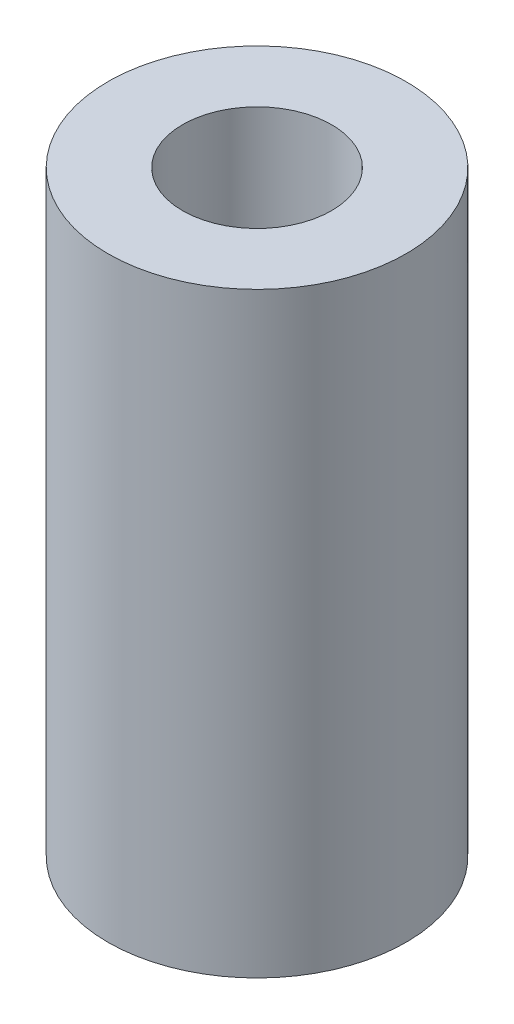
ISO-10303-21;
HEADER;
FILE_DESCRIPTION(('STEP AP214'),'2;1');
FILE_NAME('part.step','',(''),(''),'','','');
FILE_SCHEMA(('AUTOMOTIVE_DESIGN { 1 0 10303 214 1 1 1 1 }'));
ENDSEC;
DATA;
#1=APPLICATION_CONTEXT('core data for automotive mechanical design processes');
#2=APPLICATION_PROTOCOL_DEFINITION('international standard','automotive_design',2000,#1);
#3=PRODUCT_CONTEXT('',#1,'mechanical');
#4=PRODUCT('Part','Part','',(#3));
#5=PRODUCT_RELATED_PRODUCT_CATEGORY('part','',(#4));
#6=PRODUCT_DEFINITION_FORMATION('','',#4);
#7=PRODUCT_DEFINITION_CONTEXT('part definition',#1,'design');
#8=PRODUCT_DEFINITION('design','',#6,#7);
#9=PRODUCT_DEFINITION_SHAPE('','',#8);
#10=(LENGTH_UNIT() NAMED_UNIT(*) SI_UNIT(.MILLI.,.METRE.));
#11=(NAMED_UNIT(*) PLANE_ANGLE_UNIT() SI_UNIT($,.RADIAN.));
#12=(NAMED_UNIT(*) SI_UNIT($,.STERADIAN.) SOLID_ANGLE_UNIT());
#13=UNCERTAINTY_MEASURE_WITH_UNIT(LENGTH_MEASURE(1.E-05),#10,'distance_accuracy_value','');
#14=(GEOMETRIC_REPRESENTATION_CONTEXT(3) GLOBAL_UNCERTAINTY_ASSIGNED_CONTEXT((#13)) GLOBAL_UNIT_ASSIGNED_CONTEXT((#10,
#11,#12)) REPRESENTATION_CONTEXT('',''));
#15=CARTESIAN_POINT('',(0.,0.,0.));
#16=DIRECTION('',(0.,0.,1.));
#17=DIRECTION('',(1.,0.,0.));
#18=AXIS2_PLACEMENT_3D('',#15,#16,#17);
#19=CARTESIAN_POINT('',(0.,5.08,0.));
#20=DIRECTION('',(0.,1.,0.));
#21=DIRECTION('',(0.,0.,1.));
#22=AXIS2_PLACEMENT_3D('',#19,#20,#21);
#23=PLANE('',#22);
#24=CARTESIAN_POINT('',(0.,5.08,0.));
#25=DIRECTION('',(0.,1.,0.));
#26=DIRECTION('',(0.,0.,1.));
#27=AXIS2_PLACEMENT_3D('',#24,#25,#26);
#28=CIRCLE('',#27,2.54);
#29=CARTESIAN_POINT('',(0.,5.08,2.54));
#30=VERTEX_POINT('',#29);
#31=EDGE_CURVE('E10',#30,#30,#28,.T.);
#32=ORIENTED_EDGE('',*,*,#31,.T.);
#33=EDGE_LOOP('',(#32));
#34=FACE_BOUND('',#33,.T.);
#35=CARTESIAN_POINT('',(0.,5.08,0.));
#36=DIRECTION('',(0.,1.,0.));
#37=DIRECTION('',(0.,0.,1.));
#38=AXIS2_PLACEMENT_3D('',#35,#36,#37);
#39=CIRCLE('',#38,1.27);
#40=CARTESIAN_POINT('',(0.,5.08,1.27));
#41=VERTEX_POINT('',#40);
#42=EDGE_CURVE('E43',#41,#41,#39,.T.);
#43=ORIENTED_EDGE('',*,*,#42,.F.);
#44=EDGE_LOOP('',(#43));
#45=FACE_BOUND('',#44,.T.);
#46=ADVANCED_FACE('F32',(#34,#45),#23,.T.);
#47=CARTESIAN_POINT('',(0.,-5.08,0.));
#48=DIRECTION('',(0.,1.,0.));
#49=DIRECTION('',(0.,0.,1.));
#50=AXIS2_PLACEMENT_3D('',#47,#48,#49);
#51=PLANE('',#50);
#52=CARTESIAN_POINT('',(0.,-5.08,0.));
#53=DIRECTION('',(0.,1.,0.));
#54=DIRECTION('',(0.,0.,1.));
#55=AXIS2_PLACEMENT_3D('',#52,#53,#54);
#56=CIRCLE('',#55,2.54);
#57=CARTESIAN_POINT('',(0.,-5.08,2.54));
#58=VERTEX_POINT('',#57);
#59=EDGE_CURVE('E36',#58,#58,#56,.T.);
#60=ORIENTED_EDGE('',*,*,#59,.F.);
#61=EDGE_LOOP('',(#60));
#62=FACE_BOUND('',#61,.T.);
#63=CARTESIAN_POINT('',(0.,-5.08,0.));
#64=DIRECTION('',(0.,1.,0.));
#65=DIRECTION('',(0.,0.,1.));
#66=AXIS2_PLACEMENT_3D('',#63,#64,#65);
#67=CIRCLE('',#66,1.27);
#68=CARTESIAN_POINT('',(0.,-5.08,1.27));
#69=VERTEX_POINT('',#68);
#70=EDGE_CURVE('E45',#69,#69,#67,.T.);
#71=ORIENTED_EDGE('',*,*,#70,.T.);
#72=EDGE_LOOP('',(#71));
#73=FACE_BOUND('',#72,.T.);
#74=ADVANCED_FACE('F55',(#62,#73),#51,.F.);
#75=CARTESIAN_POINT('',(0.,5.08,0.));
#76=DIRECTION('',(0.,-1.,0.));
#77=DIRECTION('',(0.,0.,-1.));
#78=AXIS2_PLACEMENT_3D('',#75,#76,#77);
#79=CYLINDRICAL_SURFACE('',#78,2.54);
#80=ORIENTED_EDGE('',*,*,#31,.F.);
#81=EDGE_LOOP('',(#80));
#82=FACE_BOUND('',#81,.T.);
#83=ORIENTED_EDGE('',*,*,#59,.T.);
#84=EDGE_LOOP('',(#83));
#85=FACE_BOUND('',#84,.T.);
#86=ADVANCED_FACE('F34',(#82,#85),#79,.T.);
#87=CARTESIAN_POINT('',(0.,5.08,0.));
#88=DIRECTION('',(0.,-1.,0.));
#89=DIRECTION('',(0.,0.,-1.));
#90=AXIS2_PLACEMENT_3D('',#87,#88,#89);
#91=CYLINDRICAL_SURFACE('',#90,1.27);
#92=ORIENTED_EDGE('',*,*,#42,.T.);
#93=EDGE_LOOP('',(#92));
#94=FACE_BOUND('',#93,.T.);
#95=ORIENTED_EDGE('',*,*,#70,.F.);
#96=EDGE_LOOP('',(#95));
#97=FACE_BOUND('',#96,.T.);
#98=ADVANCED_FACE('F51',(#94,#97),#91,.F.);
#99=CLOSED_SHELL('',(#46,#74,#86,#98));
#100=MANIFOLD_SOLID_BREP('B2',#99);
#101=ADVANCED_BREP_SHAPE_REPRESENTATION('',(#18,#100),#14);
#102=SHAPE_DEFINITION_REPRESENTATION(#9,#101);
ENDSEC;
END-ISO-10303-21;
